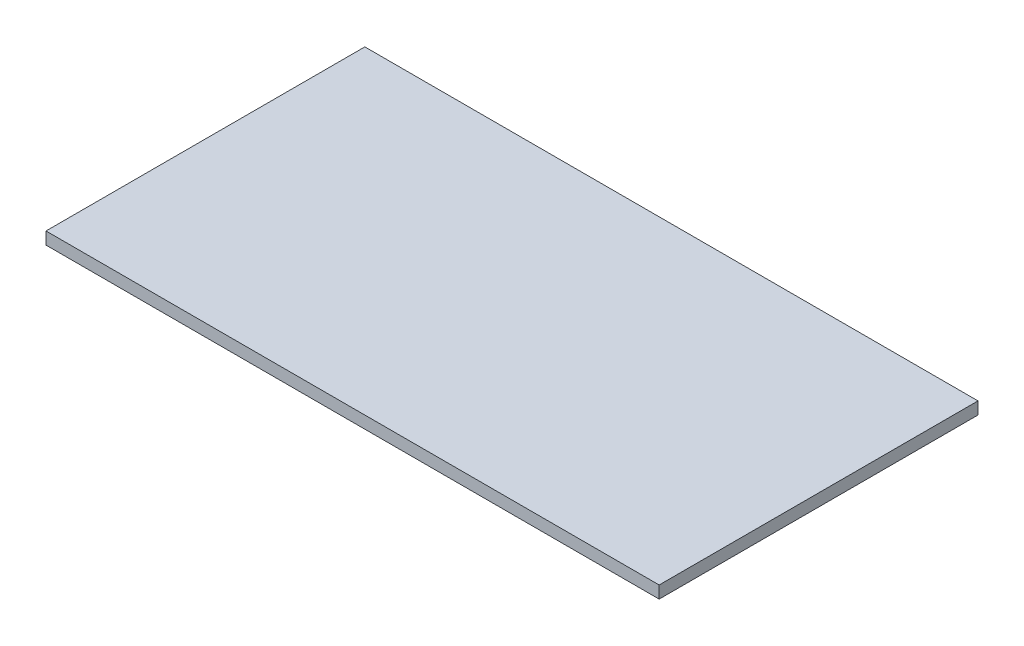
ISO-10303-21;
HEADER;
FILE_DESCRIPTION(('STEP AP214'),'2;1');
FILE_NAME('part.step','',(''),(''),'','','');
FILE_SCHEMA(('AUTOMOTIVE_DESIGN { 1 0 10303 214 1 1 1 1 }'));
ENDSEC;
DATA;
#1=APPLICATION_CONTEXT('core data for automotive mechanical design processes');
#2=APPLICATION_PROTOCOL_DEFINITION('international standard','automotive_design',2000,#1);
#3=PRODUCT_CONTEXT('',#1,'mechanical');
#4=PRODUCT('Part','Part','',(#3));
#5=PRODUCT_RELATED_PRODUCT_CATEGORY('part','',(#4));
#6=PRODUCT_DEFINITION_FORMATION('','',#4);
#7=PRODUCT_DEFINITION_CONTEXT('part definition',#1,'design');
#8=PRODUCT_DEFINITION('design','',#6,#7);
#9=PRODUCT_DEFINITION_SHAPE('','',#8);
#10=(LENGTH_UNIT() NAMED_UNIT(*) SI_UNIT(.MILLI.,.METRE.));
#11=(NAMED_UNIT(*) PLANE_ANGLE_UNIT() SI_UNIT($,.RADIAN.));
#12=(NAMED_UNIT(*) SI_UNIT($,.STERADIAN.) SOLID_ANGLE_UNIT());
#13=UNCERTAINTY_MEASURE_WITH_UNIT(LENGTH_MEASURE(1.E-05),#10,'distance_accuracy_value','');
#14=(GEOMETRIC_REPRESENTATION_CONTEXT(3) GLOBAL_UNCERTAINTY_ASSIGNED_CONTEXT((#13)) GLOBAL_UNIT_ASSIGNED_CONTEXT((#10,
#11,#12)) REPRESENTATION_CONTEXT('',''));
#15=CARTESIAN_POINT('',(0.,0.,0.));
#16=DIRECTION('',(0.,0.,1.));
#17=DIRECTION('',(1.,0.,0.));
#18=AXIS2_PLACEMENT_3D('',#15,#16,#17);
#19=CARTESIAN_POINT('',(0.,4.,0.));
#20=DIRECTION('',(1.,0.,0.));
#21=DIRECTION('',(0.,0.,-1.));
#22=AXIS2_PLACEMENT_3D('',#19,#20,#21);
#23=PLANE('',#22);
#24=DIRECTION('',(0.,0.,1.));
#25=VECTOR('',#24,1.);
#26=CARTESIAN_POINT('',(0.,0.,0.));
#27=LINE('',#26,#25);
#28=CARTESIAN_POINT('',(0.,0.,-104.));
#29=VERTEX_POINT('',#28);
#30=CARTESIAN_POINT('',(0.,0.,0.));
#31=VERTEX_POINT('',#30);
#32=EDGE_CURVE('E117',#29,#31,#27,.T.);
#33=ORIENTED_EDGE('',*,*,#32,.T.);
#34=DIRECTION('',(0.,-1.,0.));
#35=VECTOR('',#34,1.);
#36=CARTESIAN_POINT('',(0.,4.,0.));
#37=LINE('',#36,#35);
#38=CARTESIAN_POINT('',(0.,4.,0.));
#39=VERTEX_POINT('',#38);
#40=EDGE_CURVE('E11',#39,#31,#37,.T.);
#41=ORIENTED_EDGE('',*,*,#40,.F.);
#42=DIRECTION('',(0.,0.,1.));
#43=VECTOR('',#42,1.);
#44=CARTESIAN_POINT('',(0.,4.,0.));
#45=LINE('',#44,#43);
#46=CARTESIAN_POINT('',(0.,4.,-104.));
#47=VERTEX_POINT('',#46);
#48=EDGE_CURVE('E101',#47,#39,#45,.T.);
#49=ORIENTED_EDGE('',*,*,#48,.F.);
#50=DIRECTION('',(0.,-1.,0.));
#51=VECTOR('',#50,1.);
#52=CARTESIAN_POINT('',(0.,4.,-104.));
#53=LINE('',#52,#51);
#54=EDGE_CURVE('E113',#47,#29,#53,.T.);
#55=ORIENTED_EDGE('',*,*,#54,.T.);
#56=EDGE_LOOP('',(#33,#41,#49,#55));
#57=FACE_BOUND('',#56,.T.);
#58=ADVANCED_FACE('F49',(#57),#23,.F.);
#59=CARTESIAN_POINT('',(0.,4.,0.));
#60=DIRECTION('',(0.,0.,-1.));
#61=DIRECTION('',(-1.,0.,0.));
#62=AXIS2_PLACEMENT_3D('',#59,#60,#61);
#63=PLANE('',#62);
#64=DIRECTION('',(1.,0.,0.));
#65=VECTOR('',#64,1.);
#66=CARTESIAN_POINT('',(0.,0.,0.));
#67=LINE('',#66,#65);
#68=CARTESIAN_POINT('',(200.,0.,0.));
#69=VERTEX_POINT('',#68);
#70=EDGE_CURVE('E106',#31,#69,#67,.T.);
#71=ORIENTED_EDGE('',*,*,#70,.T.);
#72=DIRECTION('',(0.,-1.,0.));
#73=VECTOR('',#72,1.);
#74=CARTESIAN_POINT('',(200.,4.,0.));
#75=LINE('',#74,#73);
#76=CARTESIAN_POINT('',(200.,4.,0.));
#77=VERTEX_POINT('',#76);
#78=EDGE_CURVE('E58',#77,#69,#75,.T.);
#79=ORIENTED_EDGE('',*,*,#78,.F.);
#80=DIRECTION('',(1.,0.,0.));
#81=VECTOR('',#80,1.);
#82=CARTESIAN_POINT('',(0.,4.,0.));
#83=LINE('',#82,#81);
#84=EDGE_CURVE('E96',#39,#77,#83,.T.);
#85=ORIENTED_EDGE('',*,*,#84,.F.);
#86=ORIENTED_EDGE('',*,*,#40,.T.);
#87=EDGE_LOOP('',(#71,#79,#85,#86));
#88=FACE_BOUND('',#87,.T.);
#89=ADVANCED_FACE('F105',(#88),#63,.F.);
#90=CARTESIAN_POINT('',(200.,4.,0.));
#91=DIRECTION('',(-1.,0.,0.));
#92=DIRECTION('',(0.,0.,1.));
#93=AXIS2_PLACEMENT_3D('',#90,#91,#92);
#94=PLANE('',#93);
#95=DIRECTION('',(0.,0.,-1.));
#96=VECTOR('',#95,1.);
#97=CARTESIAN_POINT('',(200.,0.,0.));
#98=LINE('',#97,#96);
#99=CARTESIAN_POINT('',(200.,0.,-104.));
#100=VERTEX_POINT('',#99);
#101=EDGE_CURVE('E83',#69,#100,#98,.T.);
#102=ORIENTED_EDGE('',*,*,#101,.T.);
#103=DIRECTION('',(0.,-1.,0.));
#104=VECTOR('',#103,1.);
#105=CARTESIAN_POINT('',(200.,4.,-104.));
#106=LINE('',#105,#104);
#107=CARTESIAN_POINT('',(200.,4.,-104.));
#108=VERTEX_POINT('',#107);
#109=EDGE_CURVE('E108',#108,#100,#106,.T.);
#110=ORIENTED_EDGE('',*,*,#109,.F.);
#111=DIRECTION('',(0.,0.,-1.));
#112=VECTOR('',#111,1.);
#113=CARTESIAN_POINT('',(200.,4.,0.));
#114=LINE('',#113,#112);
#115=EDGE_CURVE('E99',#77,#108,#114,.T.);
#116=ORIENTED_EDGE('',*,*,#115,.F.);
#117=ORIENTED_EDGE('',*,*,#78,.T.);
#118=EDGE_LOOP('',(#102,#110,#116,#117));
#119=FACE_BOUND('',#118,.T.);
#120=ADVANCED_FACE('F109',(#119),#94,.F.);
#121=CARTESIAN_POINT('',(0.,4.,-104.));
#122=DIRECTION('',(0.,0.,1.));
#123=DIRECTION('',(1.,0.,0.));
#124=AXIS2_PLACEMENT_3D('',#121,#122,#123);
#125=PLANE('',#124);
#126=DIRECTION('',(-1.,0.,0.));
#127=VECTOR('',#126,1.);
#128=CARTESIAN_POINT('',(0.,0.,-104.));
#129=LINE('',#128,#127);
#130=EDGE_CURVE('E89',#100,#29,#129,.T.);
#131=ORIENTED_EDGE('',*,*,#130,.T.);
#132=ORIENTED_EDGE('',*,*,#54,.F.);
#133=DIRECTION('',(-1.,0.,0.));
#134=VECTOR('',#133,1.);
#135=CARTESIAN_POINT('',(0.,4.,-104.));
#136=LINE('',#135,#134);
#137=EDGE_CURVE('E66',#108,#47,#136,.T.);
#138=ORIENTED_EDGE('',*,*,#137,.F.);
#139=ORIENTED_EDGE('',*,*,#109,.T.);
#140=EDGE_LOOP('',(#131,#132,#138,#139));
#141=FACE_BOUND('',#140,.T.);
#142=ADVANCED_FACE('F130',(#141),#125,.F.);
#143=CARTESIAN_POINT('',(0.,4.,0.));
#144=DIRECTION('',(0.,-1.,0.));
#145=DIRECTION('',(0.,0.,-1.));
#146=AXIS2_PLACEMENT_3D('',#143,#144,#145);
#147=PLANE('',#146);
#148=ORIENTED_EDGE('',*,*,#48,.T.);
#149=ORIENTED_EDGE('',*,*,#84,.T.);
#150=ORIENTED_EDGE('',*,*,#115,.T.);
#151=ORIENTED_EDGE('',*,*,#137,.T.);
#152=EDGE_LOOP('',(#148,#149,#150,#151));
#153=FACE_BOUND('',#152,.T.);
#154=ADVANCED_FACE('F97',(#153),#147,.F.);
#155=CARTESIAN_POINT('',(0.,0.,0.));
#156=DIRECTION('',(0.,-1.,0.));
#157=DIRECTION('',(0.,0.,-1.));
#158=AXIS2_PLACEMENT_3D('',#155,#156,#157);
#159=PLANE('',#158);
#160=ORIENTED_EDGE('',*,*,#32,.F.);
#161=ORIENTED_EDGE('',*,*,#130,.F.);
#162=ORIENTED_EDGE('',*,*,#101,.F.);
#163=ORIENTED_EDGE('',*,*,#70,.F.);
#164=EDGE_LOOP('',(#160,#161,#162,#163));
#165=FACE_BOUND('',#164,.T.);
#166=ADVANCED_FACE('F133',(#165),#159,.T.);
#167=CLOSED_SHELL('',(#58,#89,#120,#142,#154,#166));
#168=MANIFOLD_SOLID_BREP('B2',#167);
#169=ADVANCED_BREP_SHAPE_REPRESENTATION('',(#18,#168),#14);
#170=SHAPE_DEFINITION_REPRESENTATION(#9,#169);
ENDSEC;
END-ISO-10303-21;
